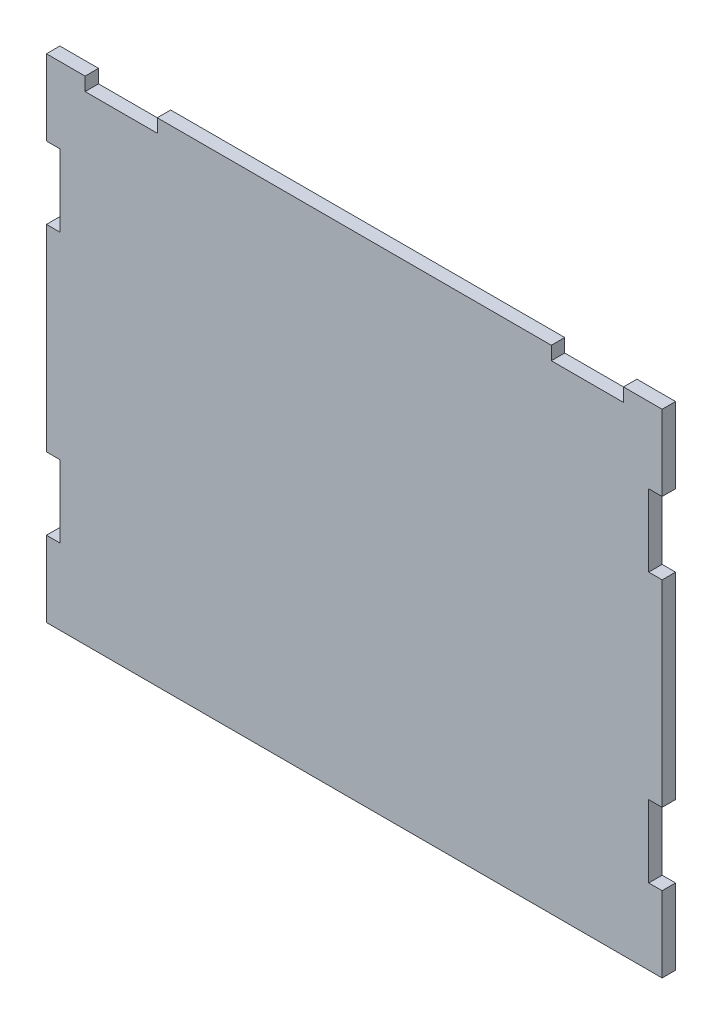
ISO-10303-21;
HEADER;
FILE_DESCRIPTION(('STEP AP214'),'2;1');
FILE_NAME('part.step','',(''),(''),'','','');
FILE_SCHEMA(('AUTOMOTIVE_DESIGN { 1 0 10303 214 1 1 1 1 }'));
ENDSEC;
DATA;
#1=APPLICATION_CONTEXT('core data for automotive mechanical design processes');
#2=APPLICATION_PROTOCOL_DEFINITION('international standard','automotive_design',2000,#1);
#3=PRODUCT_CONTEXT('',#1,'mechanical');
#4=PRODUCT('Part','Part','',(#3));
#5=PRODUCT_RELATED_PRODUCT_CATEGORY('part','',(#4));
#6=PRODUCT_DEFINITION_FORMATION('','',#4);
#7=PRODUCT_DEFINITION_CONTEXT('part definition',#1,'design');
#8=PRODUCT_DEFINITION('design','',#6,#7);
#9=PRODUCT_DEFINITION_SHAPE('','',#8);
#10=(LENGTH_UNIT() NAMED_UNIT(*) SI_UNIT(.MILLI.,.METRE.));
#11=(NAMED_UNIT(*) PLANE_ANGLE_UNIT() SI_UNIT($,.RADIAN.));
#12=(NAMED_UNIT(*) SI_UNIT($,.STERADIAN.) SOLID_ANGLE_UNIT());
#13=UNCERTAINTY_MEASURE_WITH_UNIT(LENGTH_MEASURE(1.E-05),#10,'distance_accuracy_value','');
#14=(GEOMETRIC_REPRESENTATION_CONTEXT(3) GLOBAL_UNCERTAINTY_ASSIGNED_CONTEXT((#13)) GLOBAL_UNIT_ASSIGNED_CONTEXT((#10,
#11,#12)) REPRESENTATION_CONTEXT('',''));
#15=CARTESIAN_POINT('',(0.,0.,0.));
#16=DIRECTION('',(0.,0.,1.));
#17=DIRECTION('',(1.,0.,0.));
#18=AXIS2_PLACEMENT_3D('',#15,#16,#17);
#19=CARTESIAN_POINT('',(0.,0.,5.45));
#20=DIRECTION('',(-1.,0.,0.));
#21=DIRECTION('',(0.,-1.,0.));
#22=AXIS2_PLACEMENT_3D('',#19,#20,#21);
#23=PLANE('',#22);
#24=DIRECTION('',(0.,1.,0.));
#25=VECTOR('',#24,1.);
#26=CARTESIAN_POINT('',(0.,0.,0.));
#27=LINE('',#26,#25);
#28=CARTESIAN_POINT('',(0.,-30.7,0.));
#29=VERTEX_POINT('',#28);
#30=CARTESIAN_POINT('',(0.,0.,0.));
#31=VERTEX_POINT('',#30);
#32=EDGE_CURVE('E264',#29,#31,#27,.T.);
#33=ORIENTED_EDGE('',*,*,#32,.T.);
#34=DIRECTION('',(0.,0.,-1.));
#35=VECTOR('',#34,1.);
#36=CARTESIAN_POINT('',(0.,0.,5.45));
#37=LINE('',#36,#35);
#38=CARTESIAN_POINT('',(0.,0.,5.45));
#39=VERTEX_POINT('',#38);
#40=EDGE_CURVE('E11',#39,#31,#37,.T.);
#41=ORIENTED_EDGE('',*,*,#40,.F.);
#42=DIRECTION('',(0.,1.,0.));
#43=VECTOR('',#42,1.);
#44=CARTESIAN_POINT('',(0.,0.,5.45));
#45=LINE('',#44,#43);
#46=CARTESIAN_POINT('',(0.,-30.7,5.45));
#47=VERTEX_POINT('',#46);
#48=EDGE_CURVE('E346',#47,#39,#45,.T.);
#49=ORIENTED_EDGE('',*,*,#48,.F.);
#50=DIRECTION('',(0.,0.,-1.));
#51=VECTOR('',#50,1.);
#52=CARTESIAN_POINT('',(0.,-30.7,5.45));
#53=LINE('',#52,#51);
#54=EDGE_CURVE('E260',#47,#29,#53,.T.);
#55=ORIENTED_EDGE('',*,*,#54,.T.);
#56=EDGE_LOOP('',(#33,#41,#49,#55));
#57=FACE_BOUND('',#56,.T.);
#58=ADVANCED_FACE('F43',(#57),#23,.F.);
#59=CARTESIAN_POINT('',(0.,0.,5.45));
#60=DIRECTION('',(0.,-1.,0.));
#61=DIRECTION('',(1.,0.,0.));
#62=AXIS2_PLACEMENT_3D('',#59,#60,#61);
#63=PLANE('',#62);
#64=DIRECTION('',(-1.,0.,0.));
#65=VECTOR('',#64,1.);
#66=CARTESIAN_POINT('',(0.,0.,0.));
#67=LINE('',#66,#65);
#68=CARTESIAN_POINT('',(-15.7,0.,0.));
#69=VERTEX_POINT('',#68);
#70=EDGE_CURVE('E268',#31,#69,#67,.T.);
#71=ORIENTED_EDGE('',*,*,#70,.T.);
#72=DIRECTION('',(0.,0.,-1.));
#73=VECTOR('',#72,1.);
#74=CARTESIAN_POINT('',(-15.7,0.,5.45));
#75=LINE('',#74,#73);
#76=CARTESIAN_POINT('',(-15.7,0.,5.45));
#77=VERTEX_POINT('',#76);
#78=EDGE_CURVE('E52',#77,#69,#75,.T.);
#79=ORIENTED_EDGE('',*,*,#78,.F.);
#80=DIRECTION('',(-1.,0.,0.));
#81=VECTOR('',#80,1.);
#82=CARTESIAN_POINT('',(0.,0.,5.45));
#83=LINE('',#82,#81);
#84=EDGE_CURVE('E163',#39,#77,#83,.T.);
#85=ORIENTED_EDGE('',*,*,#84,.F.);
#86=ORIENTED_EDGE('',*,*,#40,.T.);
#87=EDGE_LOOP('',(#71,#79,#85,#86));
#88=FACE_BOUND('',#87,.T.);
#89=ADVANCED_FACE('F552',(#88),#63,.F.);
#90=CARTESIAN_POINT('',(-15.7,0.,5.45));
#91=DIRECTION('',(1.,0.,0.));
#92=DIRECTION('',(0.,1.,0.));
#93=AXIS2_PLACEMENT_3D('',#90,#91,#92);
#94=PLANE('',#93);
#95=DIRECTION('',(0.,-1.,0.));
#96=VECTOR('',#95,1.);
#97=CARTESIAN_POINT('',(-15.7,0.,0.));
#98=LINE('',#97,#96);
#99=CARTESIAN_POINT('',(-15.7,-5.44999999999996,0.));
#100=VERTEX_POINT('',#99);
#101=EDGE_CURVE('E271',#69,#100,#98,.T.);
#102=ORIENTED_EDGE('',*,*,#101,.T.);
#103=DIRECTION('',(0.,0.,-1.));
#104=VECTOR('',#103,1.);
#105=CARTESIAN_POINT('',(-15.7,-5.44999999999996,5.45));
#106=LINE('',#105,#104);
#107=CARTESIAN_POINT('',(-15.7,-5.44999999999996,5.45));
#108=VERTEX_POINT('',#107);
#109=EDGE_CURVE('E437',#108,#100,#106,.T.);
#110=ORIENTED_EDGE('',*,*,#109,.F.);
#111=DIRECTION('',(0.,-1.,0.));
#112=VECTOR('',#111,1.);
#113=CARTESIAN_POINT('',(-15.7,0.,5.45));
#114=LINE('',#113,#112);
#115=EDGE_CURVE('E447',#77,#108,#114,.T.);
#116=ORIENTED_EDGE('',*,*,#115,.F.);
#117=ORIENTED_EDGE('',*,*,#78,.T.);
#118=EDGE_LOOP('',(#102,#110,#116,#117));
#119=FACE_BOUND('',#118,.T.);
#120=ADVANCED_FACE('F445',(#119),#94,.F.);
#121=CARTESIAN_POINT('',(-15.7,-5.44999999999996,5.45));
#122=DIRECTION('',(0.,-1.,0.));
#123=DIRECTION('',(1.,0.,0.));
#124=AXIS2_PLACEMENT_3D('',#121,#122,#123);
#125=PLANE('',#124);
#126=DIRECTION('',(-1.,0.,0.));
#127=VECTOR('',#126,1.);
#128=CARTESIAN_POINT('',(-15.7,-5.44999999999996,0.));
#129=LINE('',#128,#127);
#130=CARTESIAN_POINT('',(-45.,-5.44999999999996,0.));
#131=VERTEX_POINT('',#130);
#132=EDGE_CURVE('E274',#100,#131,#129,.T.);
#133=ORIENTED_EDGE('',*,*,#132,.T.);
#134=DIRECTION('',(0.,0.,-1.));
#135=VECTOR('',#134,1.);
#136=CARTESIAN_POINT('',(-45.,-5.44999999999996,5.45));
#137=LINE('',#136,#135);
#138=CARTESIAN_POINT('',(-45.,-5.44999999999996,5.45));
#139=VERTEX_POINT('',#138);
#140=EDGE_CURVE('E433',#139,#131,#137,.T.);
#141=ORIENTED_EDGE('',*,*,#140,.F.);
#142=DIRECTION('',(-1.,0.,0.));
#143=VECTOR('',#142,1.);
#144=CARTESIAN_POINT('',(-15.7,-5.44999999999996,5.45));
#145=LINE('',#144,#143);
#146=EDGE_CURVE('E466',#108,#139,#145,.T.);
#147=ORIENTED_EDGE('',*,*,#146,.F.);
#148=ORIENTED_EDGE('',*,*,#109,.T.);
#149=EDGE_LOOP('',(#133,#141,#147,#148));
#150=FACE_BOUND('',#149,.T.);
#151=ADVANCED_FACE('F456',(#150),#125,.F.);
#152=CARTESIAN_POINT('',(-45.,0.,5.45));
#153=DIRECTION('',(-1.,0.,0.));
#154=DIRECTION('',(0.,-1.,0.));
#155=AXIS2_PLACEMENT_3D('',#152,#153,#154);
#156=PLANE('',#155);
#157=DIRECTION('',(0.,1.,0.));
#158=VECTOR('',#157,1.);
#159=CARTESIAN_POINT('',(-45.,0.,0.));
#160=LINE('',#159,#158);
#161=CARTESIAN_POINT('',(-45.,0.,0.));
#162=VERTEX_POINT('',#161);
#163=EDGE_CURVE('E277',#131,#162,#160,.T.);
#164=ORIENTED_EDGE('',*,*,#163,.T.);
#165=DIRECTION('',(0.,0.,-1.));
#166=VECTOR('',#165,1.);
#167=CARTESIAN_POINT('',(-45.,0.,5.45));
#168=LINE('',#167,#166);
#169=CARTESIAN_POINT('',(-45.,0.,5.45));
#170=VERTEX_POINT('',#169);
#171=EDGE_CURVE('E429',#170,#162,#168,.T.);
#172=ORIENTED_EDGE('',*,*,#171,.F.);
#173=DIRECTION('',(0.,1.,0.));
#174=VECTOR('',#173,1.);
#175=CARTESIAN_POINT('',(-45.,0.,5.45));
#176=LINE('',#175,#174);
#177=EDGE_CURVE('E462',#139,#170,#176,.T.);
#178=ORIENTED_EDGE('',*,*,#177,.F.);
#179=ORIENTED_EDGE('',*,*,#140,.T.);
#180=EDGE_LOOP('',(#164,#172,#178,#179));
#181=FACE_BOUND('',#180,.T.);
#182=ADVANCED_FACE('F460',(#181),#156,.F.);
#183=CARTESIAN_POINT('',(-45.,0.,5.45));
#184=DIRECTION('',(0.,-1.,0.));
#185=DIRECTION('',(1.,0.,0.));
#186=AXIS2_PLACEMENT_3D('',#183,#184,#185);
#187=PLANE('',#186);
#188=DIRECTION('',(-1.,0.,0.));
#189=VECTOR('',#188,1.);
#190=CARTESIAN_POINT('',(-45.,0.,0.));
#191=LINE('',#190,#189);
#192=CARTESIAN_POINT('',(-205.,0.,0.));
#193=VERTEX_POINT('',#192);
#194=EDGE_CURVE('E280',#162,#193,#191,.T.);
#195=ORIENTED_EDGE('',*,*,#194,.T.);
#196=DIRECTION('',(0.,0.,-1.));
#197=VECTOR('',#196,1.);
#198=CARTESIAN_POINT('',(-205.,0.,5.45));
#199=LINE('',#198,#197);
#200=CARTESIAN_POINT('',(-205.,0.,5.45));
#201=VERTEX_POINT('',#200);
#202=EDGE_CURVE('E425',#201,#193,#199,.T.);
#203=ORIENTED_EDGE('',*,*,#202,.F.);
#204=DIRECTION('',(-1.,0.,0.));
#205=VECTOR('',#204,1.);
#206=CARTESIAN_POINT('',(-45.,0.,5.45));
#207=LINE('',#206,#205);
#208=EDGE_CURVE('E465',#170,#201,#207,.T.);
#209=ORIENTED_EDGE('',*,*,#208,.F.);
#210=ORIENTED_EDGE('',*,*,#171,.T.);
#211=EDGE_LOOP('',(#195,#203,#209,#210));
#212=FACE_BOUND('',#211,.T.);
#213=ADVANCED_FACE('F565',(#212),#187,.F.);
#214=CARTESIAN_POINT('',(-205.,0.,5.45));
#215=DIRECTION('',(1.,0.,0.));
#216=DIRECTION('',(0.,1.,0.));
#217=AXIS2_PLACEMENT_3D('',#214,#215,#216);
#218=PLANE('',#217);
#219=DIRECTION('',(0.,-1.,0.));
#220=VECTOR('',#219,1.);
#221=CARTESIAN_POINT('',(-205.,0.,0.));
#222=LINE('',#221,#220);
#223=CARTESIAN_POINT('',(-205.,-5.45000000000003,0.));
#224=VERTEX_POINT('',#223);
#225=EDGE_CURVE('E283',#193,#224,#222,.T.);
#226=ORIENTED_EDGE('',*,*,#225,.T.);
#227=DIRECTION('',(0.,0.,-1.));
#228=VECTOR('',#227,1.);
#229=CARTESIAN_POINT('',(-205.,-5.45000000000003,5.45));
#230=LINE('',#229,#228);
#231=CARTESIAN_POINT('',(-205.,-5.45000000000003,5.45));
#232=VERTEX_POINT('',#231);
#233=EDGE_CURVE('E421',#232,#224,#230,.T.);
#234=ORIENTED_EDGE('',*,*,#233,.F.);
#235=DIRECTION('',(0.,-1.,0.));
#236=VECTOR('',#235,1.);
#237=CARTESIAN_POINT('',(-205.,0.,5.45));
#238=LINE('',#237,#236);
#239=EDGE_CURVE('E470',#201,#232,#238,.T.);
#240=ORIENTED_EDGE('',*,*,#239,.F.);
#241=ORIENTED_EDGE('',*,*,#202,.T.);
#242=EDGE_LOOP('',(#226,#234,#240,#241));
#243=FACE_BOUND('',#242,.T.);
#244=ADVANCED_FACE('F568',(#243),#218,.F.);
#245=CARTESIAN_POINT('',(-234.3,-5.45000000000003,5.45));
#246=DIRECTION('',(0.,-1.,0.));
#247=DIRECTION('',(0.,0.,-1.));
#248=AXIS2_PLACEMENT_3D('',#245,#246,#247);
#249=PLANE('',#248);
#250=DIRECTION('',(-1.,0.,0.));
#251=VECTOR('',#250,1.);
#252=CARTESIAN_POINT('',(-234.3,-5.45000000000003,0.));
#253=LINE('',#252,#251);
#254=CARTESIAN_POINT('',(-234.3,-5.45000000000003,0.));
#255=VERTEX_POINT('',#254);
#256=EDGE_CURVE('E286',#224,#255,#253,.T.);
#257=ORIENTED_EDGE('',*,*,#256,.T.);
#258=DIRECTION('',(0.,0.,-1.));
#259=VECTOR('',#258,1.);
#260=CARTESIAN_POINT('',(-234.3,-5.45000000000003,5.45));
#261=LINE('',#260,#259);
#262=CARTESIAN_POINT('',(-234.3,-5.45000000000003,5.45));
#263=VERTEX_POINT('',#262);
#264=EDGE_CURVE('E417',#263,#255,#261,.T.);
#265=ORIENTED_EDGE('',*,*,#264,.F.);
#266=DIRECTION('',(-1.,0.,0.));
#267=VECTOR('',#266,1.);
#268=CARTESIAN_POINT('',(-234.3,-5.45000000000003,5.45));
#269=LINE('',#268,#267);
#270=EDGE_CURVE('E477',#232,#263,#269,.T.);
#271=ORIENTED_EDGE('',*,*,#270,.F.);
#272=ORIENTED_EDGE('',*,*,#233,.T.);
#273=EDGE_LOOP('',(#257,#265,#271,#272));
#274=FACE_BOUND('',#273,.T.);
#275=ADVANCED_FACE('F572',(#274),#249,.F.);
#276=CARTESIAN_POINT('',(-234.3,0.,5.45));
#277=DIRECTION('',(-1.,0.,0.));
#278=DIRECTION('',(0.,0.,1.));
#279=AXIS2_PLACEMENT_3D('',#276,#277,#278);
#280=PLANE('',#279);
#281=DIRECTION('',(0.,1.,0.));
#282=VECTOR('',#281,1.);
#283=CARTESIAN_POINT('',(-234.3,0.,0.));
#284=LINE('',#283,#282);
#285=CARTESIAN_POINT('',(-234.3,0.,0.));
#286=VERTEX_POINT('',#285);
#287=EDGE_CURVE('E289',#255,#286,#284,.T.);
#288=ORIENTED_EDGE('',*,*,#287,.T.);
#289=DIRECTION('',(0.,0.,-1.));
#290=VECTOR('',#289,1.);
#291=CARTESIAN_POINT('',(-234.3,0.,5.45));
#292=LINE('',#291,#290);
#293=CARTESIAN_POINT('',(-234.3,0.,5.45));
#294=VERTEX_POINT('',#293);
#295=EDGE_CURVE('E413',#294,#286,#292,.T.);
#296=ORIENTED_EDGE('',*,*,#295,.F.);
#297=DIRECTION('',(0.,1.,0.));
#298=VECTOR('',#297,1.);
#299=CARTESIAN_POINT('',(-234.3,0.,5.45));
#300=LINE('',#299,#298);
#301=EDGE_CURVE('E480',#263,#294,#300,.T.);
#302=ORIENTED_EDGE('',*,*,#301,.F.);
#303=ORIENTED_EDGE('',*,*,#264,.T.);
#304=EDGE_LOOP('',(#288,#296,#302,#303));
#305=FACE_BOUND('',#304,.T.);
#306=ADVANCED_FACE('F576',(#305),#280,.F.);
#307=CARTESIAN_POINT('',(-234.3,0.,5.45));
#308=DIRECTION('',(0.,-1.,0.));
#309=DIRECTION('',(1.,0.,0.));
#310=AXIS2_PLACEMENT_3D('',#307,#308,#309);
#311=PLANE('',#310);
#312=DIRECTION('',(-1.,0.,0.));
#313=VECTOR('',#312,1.);
#314=CARTESIAN_POINT('',(-234.3,0.,0.));
#315=LINE('',#314,#313);
#316=CARTESIAN_POINT('',(-250.,0.,0.));
#317=VERTEX_POINT('',#316);
#318=EDGE_CURVE('E292',#286,#317,#315,.T.);
#319=ORIENTED_EDGE('',*,*,#318,.T.);
#320=DIRECTION('',(0.,0.,-1.));
#321=VECTOR('',#320,1.);
#322=CARTESIAN_POINT('',(-250.,0.,5.45));
#323=LINE('',#322,#321);
#324=CARTESIAN_POINT('',(-250.,0.,5.45));
#325=VERTEX_POINT('',#324);
#326=EDGE_CURVE('E409',#325,#317,#323,.T.);
#327=ORIENTED_EDGE('',*,*,#326,.F.);
#328=DIRECTION('',(-1.,0.,0.));
#329=VECTOR('',#328,1.);
#330=CARTESIAN_POINT('',(-234.3,0.,5.45));
#331=LINE('',#330,#329);
#332=EDGE_CURVE('E483',#294,#325,#331,.T.);
#333=ORIENTED_EDGE('',*,*,#332,.F.);
#334=ORIENTED_EDGE('',*,*,#295,.T.);
#335=EDGE_LOOP('',(#319,#327,#333,#334));
#336=FACE_BOUND('',#335,.T.);
#337=ADVANCED_FACE('F580',(#336),#311,.F.);
#338=CARTESIAN_POINT('',(-250.,0.,5.45));
#339=DIRECTION('',(1.,0.,0.));
#340=DIRECTION('',(0.,1.,0.));
#341=AXIS2_PLACEMENT_3D('',#338,#339,#340);
#342=PLANE('',#341);
#343=DIRECTION('',(0.,-1.,0.));
#344=VECTOR('',#343,1.);
#345=CARTESIAN_POINT('',(-250.,0.,0.));
#346=LINE('',#345,#344);
#347=CARTESIAN_POINT('',(-250.,-30.7000000000001,0.));
#348=VERTEX_POINT('',#347);
#349=EDGE_CURVE('E295',#317,#348,#346,.T.);
#350=ORIENTED_EDGE('',*,*,#349,.T.);
#351=DIRECTION('',(0.,0.,-1.));
#352=VECTOR('',#351,1.);
#353=CARTESIAN_POINT('',(-250.,-30.7000000000001,5.45));
#354=LINE('',#353,#352);
#355=CARTESIAN_POINT('',(-250.,-30.7000000000001,5.45));
#356=VERTEX_POINT('',#355);
#357=EDGE_CURVE('E405',#356,#348,#354,.T.);
#358=ORIENTED_EDGE('',*,*,#357,.F.);
#359=DIRECTION('',(0.,-1.,0.));
#360=VECTOR('',#359,1.);
#361=CARTESIAN_POINT('',(-250.,0.,5.45));
#362=LINE('',#361,#360);
#363=EDGE_CURVE('E486',#325,#356,#362,.T.);
#364=ORIENTED_EDGE('',*,*,#363,.F.);
#365=ORIENTED_EDGE('',*,*,#326,.T.);
#366=EDGE_LOOP('',(#350,#358,#364,#365));
#367=FACE_BOUND('',#366,.T.);
#368=ADVANCED_FACE('F584',(#367),#342,.F.);
#369=CARTESIAN_POINT('',(-250.,-30.7000000000001,5.45));
#370=DIRECTION('',(0.,1.,0.));
#371=DIRECTION('',(-1.,0.,0.));
#372=AXIS2_PLACEMENT_3D('',#369,#370,#371);
#373=PLANE('',#372);
#374=DIRECTION('',(1.,0.,0.));
#375=VECTOR('',#374,1.);
#376=CARTESIAN_POINT('',(-250.,-30.7000000000001,0.));
#377=LINE('',#376,#375);
#378=CARTESIAN_POINT('',(-244.55,-30.7000000000001,0.));
#379=VERTEX_POINT('',#378);
#380=EDGE_CURVE('E298',#348,#379,#377,.T.);
#381=ORIENTED_EDGE('',*,*,#380,.T.);
#382=DIRECTION('',(0.,0.,-1.));
#383=VECTOR('',#382,1.);
#384=CARTESIAN_POINT('',(-244.55,-30.7000000000001,5.45));
#385=LINE('',#384,#383);
#386=CARTESIAN_POINT('',(-244.55,-30.7000000000001,5.45));
#387=VERTEX_POINT('',#386);
#388=EDGE_CURVE('E401',#387,#379,#385,.T.);
#389=ORIENTED_EDGE('',*,*,#388,.F.);
#390=DIRECTION('',(1.,0.,0.));
#391=VECTOR('',#390,1.);
#392=CARTESIAN_POINT('',(-250.,-30.7000000000001,5.45));
#393=LINE('',#392,#391);
#394=EDGE_CURVE('E489',#356,#387,#393,.T.);
#395=ORIENTED_EDGE('',*,*,#394,.F.);
#396=ORIENTED_EDGE('',*,*,#357,.T.);
#397=EDGE_LOOP('',(#381,#389,#395,#396));
#398=FACE_BOUND('',#397,.T.);
#399=ADVANCED_FACE('F588',(#398),#373,.F.);
#400=CARTESIAN_POINT('',(-244.55,-30.7000000000001,5.45));
#401=DIRECTION('',(1.,0.,0.));
#402=DIRECTION('',(0.,1.,0.));
#403=AXIS2_PLACEMENT_3D('',#400,#401,#402);
#404=PLANE('',#403);
#405=DIRECTION('',(0.,-1.,0.));
#406=VECTOR('',#405,1.);
#407=CARTESIAN_POINT('',(-244.55,-30.7000000000001,0.));
#408=LINE('',#407,#406);
#409=CARTESIAN_POINT('',(-244.55,-60.0000000000001,0.));
#410=VERTEX_POINT('',#409);
#411=EDGE_CURVE('E301',#379,#410,#408,.T.);
#412=ORIENTED_EDGE('',*,*,#411,.T.);
#413=DIRECTION('',(0.,0.,-1.));
#414=VECTOR('',#413,1.);
#415=CARTESIAN_POINT('',(-244.55,-60.0000000000001,5.45));
#416=LINE('',#415,#414);
#417=CARTESIAN_POINT('',(-244.55,-60.0000000000001,5.45));
#418=VERTEX_POINT('',#417);
#419=EDGE_CURVE('E397',#418,#410,#416,.T.);
#420=ORIENTED_EDGE('',*,*,#419,.F.);
#421=DIRECTION('',(0.,-1.,0.));
#422=VECTOR('',#421,1.);
#423=CARTESIAN_POINT('',(-244.55,-30.7000000000001,5.45));
#424=LINE('',#423,#422);
#425=EDGE_CURVE('E492',#387,#418,#424,.T.);
#426=ORIENTED_EDGE('',*,*,#425,.F.);
#427=ORIENTED_EDGE('',*,*,#388,.T.);
#428=EDGE_LOOP('',(#412,#420,#426,#427));
#429=FACE_BOUND('',#428,.T.);
#430=ADVANCED_FACE('F592',(#429),#404,.F.);
#431=CARTESIAN_POINT('',(-250.,-59.9999999999999,5.45));
#432=DIRECTION('',(0.,-1.,0.));
#433=DIRECTION('',(1.,0.,0.));
#434=AXIS2_PLACEMENT_3D('',#431,#432,#433);
#435=PLANE('',#434);
#436=DIRECTION('',(-1.,0.,0.));
#437=VECTOR('',#436,1.);
#438=CARTESIAN_POINT('',(-250.,-59.9999999999999,0.));
#439=LINE('',#438,#437);
#440=CARTESIAN_POINT('',(-250.,-59.9999999999999,0.));
#441=VERTEX_POINT('',#440);
#442=EDGE_CURVE('E304',#410,#441,#439,.T.);
#443=ORIENTED_EDGE('',*,*,#442,.T.);
#444=DIRECTION('',(0.,0.,-1.));
#445=VECTOR('',#444,1.);
#446=CARTESIAN_POINT('',(-250.,-59.9999999999999,5.45));
#447=LINE('',#446,#445);
#448=CARTESIAN_POINT('',(-250.,-59.9999999999999,5.45));
#449=VERTEX_POINT('',#448);
#450=EDGE_CURVE('E393',#449,#441,#447,.T.);
#451=ORIENTED_EDGE('',*,*,#450,.F.);
#452=DIRECTION('',(-1.,0.,0.));
#453=VECTOR('',#452,1.);
#454=CARTESIAN_POINT('',(-250.,-59.9999999999999,5.45));
#455=LINE('',#454,#453);
#456=EDGE_CURVE('E495',#418,#449,#455,.T.);
#457=ORIENTED_EDGE('',*,*,#456,.F.);
#458=ORIENTED_EDGE('',*,*,#419,.T.);
#459=EDGE_LOOP('',(#443,#451,#457,#458));
#460=FACE_BOUND('',#459,.T.);
#461=ADVANCED_FACE('F596',(#460),#435,.F.);
#462=CARTESIAN_POINT('',(-250.,-59.9999999999999,5.45));
#463=DIRECTION('',(1.,0.,0.));
#464=DIRECTION('',(0.,1.,0.));
#465=AXIS2_PLACEMENT_3D('',#462,#463,#464);
#466=PLANE('',#465);
#467=DIRECTION('',(0.,-1.,0.));
#468=VECTOR('',#467,1.);
#469=CARTESIAN_POINT('',(-250.,-59.9999999999999,0.));
#470=LINE('',#469,#468);
#471=CARTESIAN_POINT('',(-250.,-140.,0.));
#472=VERTEX_POINT('',#471);
#473=EDGE_CURVE('E307',#441,#472,#470,.T.);
#474=ORIENTED_EDGE('',*,*,#473,.T.);
#475=DIRECTION('',(0.,0.,-1.));
#476=VECTOR('',#475,1.);
#477=CARTESIAN_POINT('',(-250.,-140.,5.45));
#478=LINE('',#477,#476);
#479=CARTESIAN_POINT('',(-250.,-140.,5.45));
#480=VERTEX_POINT('',#479);
#481=EDGE_CURVE('E389',#480,#472,#478,.T.);
#482=ORIENTED_EDGE('',*,*,#481,.F.);
#483=DIRECTION('',(0.,-1.,0.));
#484=VECTOR('',#483,1.);
#485=CARTESIAN_POINT('',(-250.,-59.9999999999999,5.45));
#486=LINE('',#485,#484);
#487=EDGE_CURVE('E498',#449,#480,#486,.T.);
#488=ORIENTED_EDGE('',*,*,#487,.F.);
#489=ORIENTED_EDGE('',*,*,#450,.T.);
#490=EDGE_LOOP('',(#474,#482,#488,#489));
#491=FACE_BOUND('',#490,.T.);
#492=ADVANCED_FACE('F600',(#491),#466,.F.);
#493=CARTESIAN_POINT('',(-250.,-140.,5.45));
#494=DIRECTION('',(0.,1.,0.));
#495=DIRECTION('',(0.,0.,1.));
#496=AXIS2_PLACEMENT_3D('',#493,#494,#495);
#497=PLANE('',#496);
#498=DIRECTION('',(1.,0.,0.));
#499=VECTOR('',#498,1.);
#500=CARTESIAN_POINT('',(-250.,-140.,0.));
#501=LINE('',#500,#499);
#502=CARTESIAN_POINT('',(-244.55,-140.,0.));
#503=VERTEX_POINT('',#502);
#504=EDGE_CURVE('E310',#472,#503,#501,.T.);
#505=ORIENTED_EDGE('',*,*,#504,.T.);
#506=DIRECTION('',(0.,0.,-1.));
#507=VECTOR('',#506,1.);
#508=CARTESIAN_POINT('',(-244.55,-140.,5.45));
#509=LINE('',#508,#507);
#510=CARTESIAN_POINT('',(-244.55,-140.,5.45));
#511=VERTEX_POINT('',#510);
#512=EDGE_CURVE('E385',#511,#503,#509,.T.);
#513=ORIENTED_EDGE('',*,*,#512,.F.);
#514=DIRECTION('',(1.,0.,0.));
#515=VECTOR('',#514,1.);
#516=CARTESIAN_POINT('',(-250.,-140.,5.45));
#517=LINE('',#516,#515);
#518=EDGE_CURVE('E501',#480,#511,#517,.T.);
#519=ORIENTED_EDGE('',*,*,#518,.F.);
#520=ORIENTED_EDGE('',*,*,#481,.T.);
#521=EDGE_LOOP('',(#505,#513,#519,#520));
#522=FACE_BOUND('',#521,.T.);
#523=ADVANCED_FACE('F604',(#522),#497,.F.);
#524=CARTESIAN_POINT('',(-244.55,-169.3,5.45));
#525=DIRECTION('',(1.,0.,0.));
#526=DIRECTION('',(0.,1.,0.));
#527=AXIS2_PLACEMENT_3D('',#524,#525,#526);
#528=PLANE('',#527);
#529=DIRECTION('',(0.,-1.,0.));
#530=VECTOR('',#529,1.);
#531=CARTESIAN_POINT('',(-244.55,-169.3,0.));
#532=LINE('',#531,#530);
#533=CARTESIAN_POINT('',(-244.55,-169.3,0.));
#534=VERTEX_POINT('',#533);
#535=EDGE_CURVE('E313',#503,#534,#532,.T.);
#536=ORIENTED_EDGE('',*,*,#535,.T.);
#537=DIRECTION('',(0.,0.,-1.));
#538=VECTOR('',#537,1.);
#539=CARTESIAN_POINT('',(-244.55,-169.3,5.45));
#540=LINE('',#539,#538);
#541=CARTESIAN_POINT('',(-244.55,-169.3,5.45));
#542=VERTEX_POINT('',#541);
#543=EDGE_CURVE('E381',#542,#534,#540,.T.);
#544=ORIENTED_EDGE('',*,*,#543,.F.);
#545=DIRECTION('',(0.,-1.,0.));
#546=VECTOR('',#545,1.);
#547=CARTESIAN_POINT('',(-244.55,-169.3,5.45));
#548=LINE('',#547,#546);
#549=EDGE_CURVE('E504',#511,#542,#548,.T.);
#550=ORIENTED_EDGE('',*,*,#549,.F.);
#551=ORIENTED_EDGE('',*,*,#512,.T.);
#552=EDGE_LOOP('',(#536,#544,#550,#551));
#553=FACE_BOUND('',#552,.T.);
#554=ADVANCED_FACE('F608',(#553),#528,.F.);
#555=CARTESIAN_POINT('',(-250.,-169.3,5.45));
#556=DIRECTION('',(0.,-1.,0.));
#557=DIRECTION('',(0.,0.,-1.));
#558=AXIS2_PLACEMENT_3D('',#555,#556,#557);
#559=PLANE('',#558);
#560=DIRECTION('',(-1.,0.,0.));
#561=VECTOR('',#560,1.);
#562=CARTESIAN_POINT('',(-250.,-169.3,0.));
#563=LINE('',#562,#561);
#564=CARTESIAN_POINT('',(-250.,-169.3,0.));
#565=VERTEX_POINT('',#564);
#566=EDGE_CURVE('E316',#534,#565,#563,.T.);
#567=ORIENTED_EDGE('',*,*,#566,.T.);
#568=DIRECTION('',(0.,0.,-1.));
#569=VECTOR('',#568,1.);
#570=CARTESIAN_POINT('',(-250.,-169.3,5.45));
#571=LINE('',#570,#569);
#572=CARTESIAN_POINT('',(-250.,-169.3,5.45));
#573=VERTEX_POINT('',#572);
#574=EDGE_CURVE('E377',#573,#565,#571,.T.);
#575=ORIENTED_EDGE('',*,*,#574,.F.);
#576=DIRECTION('',(-1.,0.,0.));
#577=VECTOR('',#576,1.);
#578=CARTESIAN_POINT('',(-250.,-169.3,5.45));
#579=LINE('',#578,#577);
#580=EDGE_CURVE('E507',#542,#573,#579,.T.);
#581=ORIENTED_EDGE('',*,*,#580,.F.);
#582=ORIENTED_EDGE('',*,*,#543,.T.);
#583=EDGE_LOOP('',(#567,#575,#581,#582));
#584=FACE_BOUND('',#583,.T.);
#585=ADVANCED_FACE('F612',(#584),#559,.F.);
#586=CARTESIAN_POINT('',(-250.,-169.3,5.45));
#587=DIRECTION('',(1.,0.,0.));
#588=DIRECTION('',(0.,1.,0.));
#589=AXIS2_PLACEMENT_3D('',#586,#587,#588);
#590=PLANE('',#589);
#591=DIRECTION('',(0.,-1.,0.));
#592=VECTOR('',#591,1.);
#593=CARTESIAN_POINT('',(-250.,-169.3,0.));
#594=LINE('',#593,#592);
#595=CARTESIAN_POINT('',(-250.,-200.,0.));
#596=VERTEX_POINT('',#595);
#597=EDGE_CURVE('E319',#565,#596,#594,.T.);
#598=ORIENTED_EDGE('',*,*,#597,.T.);
#599=DIRECTION('',(0.,0.,-1.));
#600=VECTOR('',#599,1.);
#601=CARTESIAN_POINT('',(-250.,-200.,5.45));
#602=LINE('',#601,#600);
#603=CARTESIAN_POINT('',(-250.,-200.,5.45));
#604=VERTEX_POINT('',#603);
#605=EDGE_CURVE('E373',#604,#596,#602,.T.);
#606=ORIENTED_EDGE('',*,*,#605,.F.);
#607=DIRECTION('',(0.,-1.,0.));
#608=VECTOR('',#607,1.);
#609=CARTESIAN_POINT('',(-250.,-169.3,5.45));
#610=LINE('',#609,#608);
#611=EDGE_CURVE('E510',#573,#604,#610,.T.);
#612=ORIENTED_EDGE('',*,*,#611,.F.);
#613=ORIENTED_EDGE('',*,*,#574,.T.);
#614=EDGE_LOOP('',(#598,#606,#612,#613));
#615=FACE_BOUND('',#614,.T.);
#616=ADVANCED_FACE('F616',(#615),#590,.F.);
#617=CARTESIAN_POINT('',(0.,-200.,5.45));
#618=DIRECTION('',(0.,1.,0.));
#619=DIRECTION('',(-1.,0.,0.));
#620=AXIS2_PLACEMENT_3D('',#617,#618,#619);
#621=PLANE('',#620);
#622=DIRECTION('',(1.,0.,0.));
#623=VECTOR('',#622,1.);
#624=CARTESIAN_POINT('',(0.,-200.,0.));
#625=LINE('',#624,#623);
#626=CARTESIAN_POINT('',(0.,-200.,0.));
#627=VERTEX_POINT('',#626);
#628=EDGE_CURVE('E322',#596,#627,#625,.T.);
#629=ORIENTED_EDGE('',*,*,#628,.T.);
#630=DIRECTION('',(0.,0.,-1.));
#631=VECTOR('',#630,1.);
#632=CARTESIAN_POINT('',(0.,-200.,5.45));
#633=LINE('',#632,#631);
#634=CARTESIAN_POINT('',(0.,-200.,5.45));
#635=VERTEX_POINT('',#634);
#636=EDGE_CURVE('E369',#635,#627,#633,.T.);
#637=ORIENTED_EDGE('',*,*,#636,.F.);
#638=DIRECTION('',(1.,0.,0.));
#639=VECTOR('',#638,1.);
#640=CARTESIAN_POINT('',(0.,-200.,5.45));
#641=LINE('',#640,#639);
#642=EDGE_CURVE('E513',#604,#635,#641,.T.);
#643=ORIENTED_EDGE('',*,*,#642,.F.);
#644=ORIENTED_EDGE('',*,*,#605,.T.);
#645=EDGE_LOOP('',(#629,#637,#643,#644));
#646=FACE_BOUND('',#645,.T.);
#647=ADVANCED_FACE('F620',(#646),#621,.F.);
#648=CARTESIAN_POINT('',(1.03666125598489E-13,-169.3,5.45));
#649=DIRECTION('',(-1.,0.,0.));
#650=DIRECTION('',(0.,-1.,0.));
#651=AXIS2_PLACEMENT_3D('',#648,#649,#650);
#652=PLANE('',#651);
#653=DIRECTION('',(0.,1.,0.));
#654=VECTOR('',#653,1.);
#655=CARTESIAN_POINT('',(1.03666125598489E-13,-169.3,0.));
#656=LINE('',#655,#654);
#657=CARTESIAN_POINT('',(1.03666125598489E-13,-169.3,0.));
#658=VERTEX_POINT('',#657);
#659=EDGE_CURVE('E325',#627,#658,#656,.T.);
#660=ORIENTED_EDGE('',*,*,#659,.T.);
#661=DIRECTION('',(0.,0.,-1.));
#662=VECTOR('',#661,1.);
#663=CARTESIAN_POINT('',(1.03666125598489E-13,-169.3,5.45));
#664=LINE('',#663,#662);
#665=CARTESIAN_POINT('',(1.03666125598489E-13,-169.3,5.45));
#666=VERTEX_POINT('',#665);
#667=EDGE_CURVE('E365',#666,#658,#664,.T.);
#668=ORIENTED_EDGE('',*,*,#667,.F.);
#669=DIRECTION('',(0.,1.,0.));
#670=VECTOR('',#669,1.);
#671=CARTESIAN_POINT('',(1.03666125598489E-13,-169.3,5.45));
#672=LINE('',#671,#670);
#673=EDGE_CURVE('E516',#635,#666,#672,.T.);
#674=ORIENTED_EDGE('',*,*,#673,.F.);
#675=ORIENTED_EDGE('',*,*,#636,.T.);
#676=EDGE_LOOP('',(#660,#668,#674,#675));
#677=FACE_BOUND('',#676,.T.);
#678=ADVANCED_FACE('F624',(#677),#652,.F.);
#679=CARTESIAN_POINT('',(1.03666125598489E-13,-169.3,5.45));
#680=DIRECTION('',(0.,-1.,0.));
#681=DIRECTION('',(0.,0.,-1.));
#682=AXIS2_PLACEMENT_3D('',#679,#680,#681);
#683=PLANE('',#682);
#684=DIRECTION('',(-1.,0.,0.));
#685=VECTOR('',#684,1.);
#686=CARTESIAN_POINT('',(1.03666125598489E-13,-169.3,0.));
#687=LINE('',#686,#685);
#688=CARTESIAN_POINT('',(-5.44999999999987,-169.3,0.));
#689=VERTEX_POINT('',#688);
#690=EDGE_CURVE('E328',#658,#689,#687,.T.);
#691=ORIENTED_EDGE('',*,*,#690,.T.);
#692=DIRECTION('',(0.,0.,-1.));
#693=VECTOR('',#692,1.);
#694=CARTESIAN_POINT('',(-5.44999999999987,-169.3,5.45));
#695=LINE('',#694,#693);
#696=CARTESIAN_POINT('',(-5.44999999999987,-169.3,5.45));
#697=VERTEX_POINT('',#696);
#698=EDGE_CURVE('E361',#697,#689,#695,.T.);
#699=ORIENTED_EDGE('',*,*,#698,.F.);
#700=DIRECTION('',(-1.,0.,0.));
#701=VECTOR('',#700,1.);
#702=CARTESIAN_POINT('',(1.03666125598489E-13,-169.3,5.45));
#703=LINE('',#702,#701);
#704=EDGE_CURVE('E519',#666,#697,#703,.T.);
#705=ORIENTED_EDGE('',*,*,#704,.F.);
#706=ORIENTED_EDGE('',*,*,#667,.T.);
#707=EDGE_LOOP('',(#691,#699,#705,#706));
#708=FACE_BOUND('',#707,.T.);
#709=ADVANCED_FACE('F628',(#708),#683,.F.);
#710=CARTESIAN_POINT('',(-5.44999999999987,-169.3,5.45));
#711=DIRECTION('',(-1.,0.,0.));
#712=DIRECTION('',(0.,0.,1.));
#713=AXIS2_PLACEMENT_3D('',#710,#711,#712);
#714=PLANE('',#713);
#715=DIRECTION('',(0.,1.,0.));
#716=VECTOR('',#715,1.);
#717=CARTESIAN_POINT('',(-5.44999999999987,-169.3,0.));
#718=LINE('',#717,#716);
#719=CARTESIAN_POINT('',(-5.44999999999987,-140.,0.));
#720=VERTEX_POINT('',#719);
#721=EDGE_CURVE('E331',#689,#720,#718,.T.);
#722=ORIENTED_EDGE('',*,*,#721,.T.);
#723=DIRECTION('',(0.,0.,-1.));
#724=VECTOR('',#723,1.);
#725=CARTESIAN_POINT('',(-5.44999999999987,-140.,5.45));
#726=LINE('',#725,#724);
#727=CARTESIAN_POINT('',(-5.44999999999987,-140.,5.45));
#728=VERTEX_POINT('',#727);
#729=EDGE_CURVE('E357',#728,#720,#726,.T.);
#730=ORIENTED_EDGE('',*,*,#729,.F.);
#731=DIRECTION('',(0.,1.,0.));
#732=VECTOR('',#731,1.);
#733=CARTESIAN_POINT('',(-5.44999999999987,-169.3,5.45));
#734=LINE('',#733,#732);
#735=EDGE_CURVE('E522',#697,#728,#734,.T.);
#736=ORIENTED_EDGE('',*,*,#735,.F.);
#737=ORIENTED_EDGE('',*,*,#698,.T.);
#738=EDGE_LOOP('',(#722,#730,#736,#737));
#739=FACE_BOUND('',#738,.T.);
#740=ADVANCED_FACE('F632',(#739),#714,.F.);
#741=CARTESIAN_POINT('',(0.,-140.,5.45));
#742=DIRECTION('',(0.,1.,0.));
#743=DIRECTION('',(0.,0.,1.));
#744=AXIS2_PLACEMENT_3D('',#741,#742,#743);
#745=PLANE('',#744);
#746=DIRECTION('',(1.,0.,0.));
#747=VECTOR('',#746,1.);
#748=CARTESIAN_POINT('',(0.,-140.,0.));
#749=LINE('',#748,#747);
#750=CARTESIAN_POINT('',(0.,-140.,0.));
#751=VERTEX_POINT('',#750);
#752=EDGE_CURVE('E334',#720,#751,#749,.T.);
#753=ORIENTED_EDGE('',*,*,#752,.T.);
#754=DIRECTION('',(0.,0.,-1.));
#755=VECTOR('',#754,1.);
#756=CARTESIAN_POINT('',(0.,-140.,5.45));
#757=LINE('',#756,#755);
#758=CARTESIAN_POINT('',(0.,-140.,5.45));
#759=VERTEX_POINT('',#758);
#760=EDGE_CURVE('E353',#759,#751,#757,.T.);
#761=ORIENTED_EDGE('',*,*,#760,.F.);
#762=DIRECTION('',(1.,0.,0.));
#763=VECTOR('',#762,1.);
#764=CARTESIAN_POINT('',(0.,-140.,5.45));
#765=LINE('',#764,#763);
#766=EDGE_CURVE('E525',#728,#759,#765,.T.);
#767=ORIENTED_EDGE('',*,*,#766,.F.);
#768=ORIENTED_EDGE('',*,*,#729,.T.);
#769=EDGE_LOOP('',(#753,#761,#767,#768));
#770=FACE_BOUND('',#769,.T.);
#771=ADVANCED_FACE('F533',(#770),#745,.F.);
#772=CARTESIAN_POINT('',(0.,-59.9999999999999,5.45));
#773=DIRECTION('',(-1.,0.,0.));
#774=DIRECTION('',(0.,-1.,0.));
#775=AXIS2_PLACEMENT_3D('',#772,#773,#774);
#776=PLANE('',#775);
#777=DIRECTION('',(0.,1.,0.));
#778=VECTOR('',#777,1.);
#779=CARTESIAN_POINT('',(0.,-59.9999999999999,0.));
#780=LINE('',#779,#778);
#781=CARTESIAN_POINT('',(0.,-59.9999999999999,0.));
#782=VERTEX_POINT('',#781);
#783=EDGE_CURVE('E337',#751,#782,#780,.T.);
#784=ORIENTED_EDGE('',*,*,#783,.T.);
#785=DIRECTION('',(0.,0.,-1.));
#786=VECTOR('',#785,1.);
#787=CARTESIAN_POINT('',(0.,-59.9999999999999,5.45));
#788=LINE('',#787,#786);
#789=CARTESIAN_POINT('',(0.,-59.9999999999999,5.45));
#790=VERTEX_POINT('',#789);
#791=EDGE_CURVE('E253',#790,#782,#788,.T.);
#792=ORIENTED_EDGE('',*,*,#791,.F.);
#793=DIRECTION('',(0.,1.,0.));
#794=VECTOR('',#793,1.);
#795=CARTESIAN_POINT('',(0.,-59.9999999999999,5.45));
#796=LINE('',#795,#794);
#797=EDGE_CURVE('E242',#759,#790,#796,.T.);
#798=ORIENTED_EDGE('',*,*,#797,.F.);
#799=ORIENTED_EDGE('',*,*,#760,.T.);
#800=EDGE_LOOP('',(#784,#792,#798,#799));
#801=FACE_BOUND('',#800,.T.);
#802=ADVANCED_FACE('F537',(#801),#776,.F.);
#803=CARTESIAN_POINT('',(0.,-59.9999999999999,5.45));
#804=DIRECTION('',(0.,-1.,0.));
#805=DIRECTION('',(1.,0.,0.));
#806=AXIS2_PLACEMENT_3D('',#803,#804,#805);
#807=PLANE('',#806);
#808=DIRECTION('',(-1.,0.,0.));
#809=VECTOR('',#808,1.);
#810=CARTESIAN_POINT('',(0.,-59.9999999999999,0.));
#811=LINE('',#810,#809);
#812=CARTESIAN_POINT('',(-5.44999999999997,-60.,0.));
#813=VERTEX_POINT('',#812);
#814=EDGE_CURVE('E251',#782,#813,#811,.T.);
#815=ORIENTED_EDGE('',*,*,#814,.T.);
#816=DIRECTION('',(0.,0.,-1.));
#817=VECTOR('',#816,1.);
#818=CARTESIAN_POINT('',(-5.44999999999997,-60.,5.45));
#819=LINE('',#818,#817);
#820=CARTESIAN_POINT('',(-5.44999999999997,-60.,5.45));
#821=VERTEX_POINT('',#820);
#822=EDGE_CURVE('E248',#821,#813,#819,.T.);
#823=ORIENTED_EDGE('',*,*,#822,.F.);
#824=DIRECTION('',(-1.,0.,0.));
#825=VECTOR('',#824,1.);
#826=CARTESIAN_POINT('',(0.,-59.9999999999999,5.45));
#827=LINE('',#826,#825);
#828=EDGE_CURVE('E236',#790,#821,#827,.T.);
#829=ORIENTED_EDGE('',*,*,#828,.F.);
#830=ORIENTED_EDGE('',*,*,#791,.T.);
#831=EDGE_LOOP('',(#815,#823,#829,#830));
#832=FACE_BOUND('',#831,.T.);
#833=ADVANCED_FACE('F249',(#832),#807,.F.);
#834=CARTESIAN_POINT('',(-5.44999999999998,-30.7,5.45));
#835=DIRECTION('',(-1.,0.,0.));
#836=DIRECTION('',(0.,-1.,0.));
#837=AXIS2_PLACEMENT_3D('',#834,#835,#836);
#838=PLANE('',#837);
#839=DIRECTION('',(0.,1.,0.));
#840=VECTOR('',#839,1.);
#841=CARTESIAN_POINT('',(-5.44999999999998,-30.7,0.));
#842=LINE('',#841,#840);
#843=CARTESIAN_POINT('',(-5.44999999999998,-30.7,0.));
#844=VERTEX_POINT('',#843);
#845=EDGE_CURVE('E149',#813,#844,#842,.T.);
#846=ORIENTED_EDGE('',*,*,#845,.T.);
#847=DIRECTION('',(0.,0.,-1.));
#848=VECTOR('',#847,1.);
#849=CARTESIAN_POINT('',(-5.44999999999998,-30.7,5.45));
#850=LINE('',#849,#848);
#851=CARTESIAN_POINT('',(-5.44999999999998,-30.7,5.45));
#852=VERTEX_POINT('',#851);
#853=EDGE_CURVE('E254',#852,#844,#850,.T.);
#854=ORIENTED_EDGE('',*,*,#853,.F.);
#855=DIRECTION('',(0.,1.,0.));
#856=VECTOR('',#855,1.);
#857=CARTESIAN_POINT('',(-5.44999999999998,-30.7,5.45));
#858=LINE('',#857,#856);
#859=EDGE_CURVE('E240',#821,#852,#858,.T.);
#860=ORIENTED_EDGE('',*,*,#859,.F.);
#861=ORIENTED_EDGE('',*,*,#822,.T.);
#862=EDGE_LOOP('',(#846,#854,#860,#861));
#863=FACE_BOUND('',#862,.T.);
#864=ADVANCED_FACE('F256',(#863),#838,.F.);
#865=CARTESIAN_POINT('',(0.,-30.7,5.45));
#866=DIRECTION('',(0.,1.,0.));
#867=DIRECTION('',(0.,0.,1.));
#868=AXIS2_PLACEMENT_3D('',#865,#866,#867);
#869=PLANE('',#868);
#870=DIRECTION('',(1.,0.,0.));
#871=VECTOR('',#870,1.);
#872=CARTESIAN_POINT('',(0.,-30.7,0.));
#873=LINE('',#872,#871);
#874=EDGE_CURVE('E155',#844,#29,#873,.T.);
#875=ORIENTED_EDGE('',*,*,#874,.T.);
#876=ORIENTED_EDGE('',*,*,#54,.F.);
#877=DIRECTION('',(1.,0.,0.));
#878=VECTOR('',#877,1.);
#879=CARTESIAN_POINT('',(0.,-30.7,5.45));
#880=LINE('',#879,#878);
#881=EDGE_CURVE('E60',#852,#47,#880,.T.);
#882=ORIENTED_EDGE('',*,*,#881,.F.);
#883=ORIENTED_EDGE('',*,*,#853,.T.);
#884=EDGE_LOOP('',(#875,#876,#882,#883));
#885=FACE_BOUND('',#884,.T.);
#886=ADVANCED_FACE('F541',(#885),#869,.F.);
#887=CARTESIAN_POINT('',(0.,0.,5.45));
#888=DIRECTION('',(0.,0.,-1.));
#889=DIRECTION('',(-1.,0.,0.));
#890=AXIS2_PLACEMENT_3D('',#887,#888,#889);
#891=PLANE('',#890);
#892=ORIENTED_EDGE('',*,*,#48,.T.);
#893=ORIENTED_EDGE('',*,*,#84,.T.);
#894=ORIENTED_EDGE('',*,*,#115,.T.);
#895=ORIENTED_EDGE('',*,*,#146,.T.);
#896=ORIENTED_EDGE('',*,*,#177,.T.);
#897=ORIENTED_EDGE('',*,*,#208,.T.);
#898=ORIENTED_EDGE('',*,*,#239,.T.);
#899=ORIENTED_EDGE('',*,*,#270,.T.);
#900=ORIENTED_EDGE('',*,*,#301,.T.);
#901=ORIENTED_EDGE('',*,*,#332,.T.);
#902=ORIENTED_EDGE('',*,*,#363,.T.);
#903=ORIENTED_EDGE('',*,*,#394,.T.);
#904=ORIENTED_EDGE('',*,*,#425,.T.);
#905=ORIENTED_EDGE('',*,*,#456,.T.);
#906=ORIENTED_EDGE('',*,*,#487,.T.);
#907=ORIENTED_EDGE('',*,*,#518,.T.);
#908=ORIENTED_EDGE('',*,*,#549,.T.);
#909=ORIENTED_EDGE('',*,*,#580,.T.);
#910=ORIENTED_EDGE('',*,*,#611,.T.);
#911=ORIENTED_EDGE('',*,*,#642,.T.);
#912=ORIENTED_EDGE('',*,*,#673,.T.);
#913=ORIENTED_EDGE('',*,*,#704,.T.);
#914=ORIENTED_EDGE('',*,*,#735,.T.);
#915=ORIENTED_EDGE('',*,*,#766,.T.);
#916=ORIENTED_EDGE('',*,*,#797,.T.);
#917=ORIENTED_EDGE('',*,*,#828,.T.);
#918=ORIENTED_EDGE('',*,*,#859,.T.);
#919=ORIENTED_EDGE('',*,*,#881,.T.);
#920=EDGE_LOOP('',(#892,#893,#894,#895,#896,#897,#898,#899,#900,#901,#902,#903,#904,#905,#906,
#907,#908,#909,#910,#911,#912,#913,#914,#915,#916,#917,#918,#919));
#921=FACE_BOUND('',#920,.T.);
#922=ADVANCED_FACE('F238',(#921),#891,.F.);
#923=CARTESIAN_POINT('',(0.,0.,0.));
#924=DIRECTION('',(0.,0.,-1.));
#925=DIRECTION('',(-1.,0.,0.));
#926=AXIS2_PLACEMENT_3D('',#923,#924,#925);
#927=PLANE('',#926);
#928=ORIENTED_EDGE('',*,*,#32,.F.);
#929=ORIENTED_EDGE('',*,*,#874,.F.);
#930=ORIENTED_EDGE('',*,*,#845,.F.);
#931=ORIENTED_EDGE('',*,*,#814,.F.);
#932=ORIENTED_EDGE('',*,*,#783,.F.);
#933=ORIENTED_EDGE('',*,*,#752,.F.);
#934=ORIENTED_EDGE('',*,*,#721,.F.);
#935=ORIENTED_EDGE('',*,*,#690,.F.);
#936=ORIENTED_EDGE('',*,*,#659,.F.);
#937=ORIENTED_EDGE('',*,*,#628,.F.);
#938=ORIENTED_EDGE('',*,*,#597,.F.);
#939=ORIENTED_EDGE('',*,*,#566,.F.);
#940=ORIENTED_EDGE('',*,*,#535,.F.);
#941=ORIENTED_EDGE('',*,*,#504,.F.);
#942=ORIENTED_EDGE('',*,*,#473,.F.);
#943=ORIENTED_EDGE('',*,*,#442,.F.);
#944=ORIENTED_EDGE('',*,*,#411,.F.);
#945=ORIENTED_EDGE('',*,*,#380,.F.);
#946=ORIENTED_EDGE('',*,*,#349,.F.);
#947=ORIENTED_EDGE('',*,*,#318,.F.);
#948=ORIENTED_EDGE('',*,*,#287,.F.);
#949=ORIENTED_EDGE('',*,*,#256,.F.);
#950=ORIENTED_EDGE('',*,*,#225,.F.);
#951=ORIENTED_EDGE('',*,*,#194,.F.);
#952=ORIENTED_EDGE('',*,*,#163,.F.);
#953=ORIENTED_EDGE('',*,*,#132,.F.);
#954=ORIENTED_EDGE('',*,*,#101,.F.);
#955=ORIENTED_EDGE('',*,*,#70,.F.);
#956=EDGE_LOOP('',(#928,#929,#930,#931,#932,#933,#934,#935,#936,#937,#938,#939,#940,#941,#942,
#943,#944,#945,#946,#947,#948,#949,#950,#951,#952,#953,#954,#955));
#957=FACE_BOUND('',#956,.T.);
#958=ADVANCED_FACE('F451',(#957),#927,.T.);
#959=CLOSED_SHELL('',(#58,#89,#120,#151,#182,#213,#244,#275,#306,#337,#368,#399,#430,#461,#492,
#523,#554,#585,#616,#647,#678,#709,#740,#771,#802,#833,#864,#886,#922,#958));
#960=MANIFOLD_SOLID_BREP('B2',#959);
#961=ADVANCED_BREP_SHAPE_REPRESENTATION('',(#18,#960),#14);
#962=SHAPE_DEFINITION_REPRESENTATION(#9,#961);
ENDSEC;
END-ISO-10303-21;
